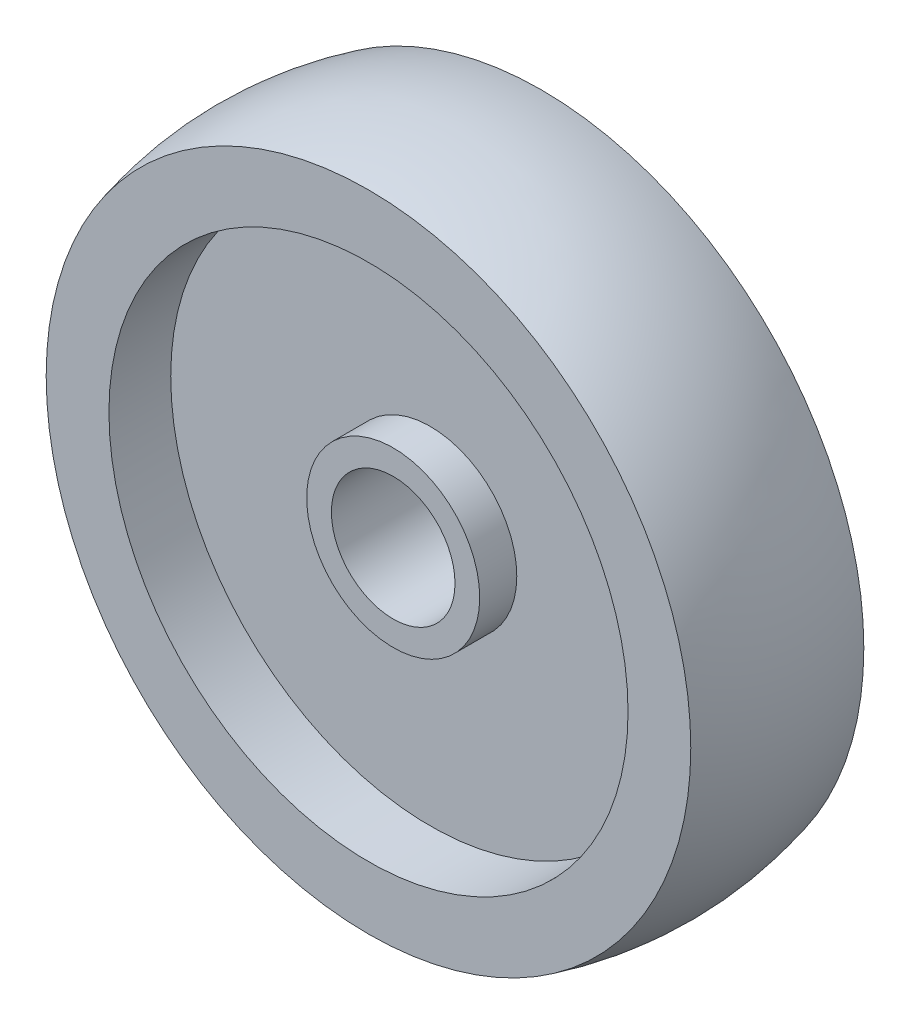
ISO-10303-21;
HEADER;
FILE_DESCRIPTION(('STEP AP214'),'2;1');
FILE_NAME('part.step','',(''),(''),'','','');
FILE_SCHEMA(('AUTOMOTIVE_DESIGN { 1 0 10303 214 1 1 1 1 }'));
ENDSEC;
DATA;
#1=APPLICATION_CONTEXT('core data for automotive mechanical design processes');
#2=APPLICATION_PROTOCOL_DEFINITION('international standard','automotive_design',2000,#1);
#3=PRODUCT_CONTEXT('',#1,'mechanical');
#4=PRODUCT('Part','Part','',(#3));
#5=PRODUCT_RELATED_PRODUCT_CATEGORY('part','',(#4));
#6=PRODUCT_DEFINITION_FORMATION('','',#4);
#7=PRODUCT_DEFINITION_CONTEXT('part definition',#1,'design');
#8=PRODUCT_DEFINITION('design','',#6,#7);
#9=PRODUCT_DEFINITION_SHAPE('','',#8);
#10=(LENGTH_UNIT() NAMED_UNIT(*) SI_UNIT(.MILLI.,.METRE.));
#11=(NAMED_UNIT(*) PLANE_ANGLE_UNIT() SI_UNIT($,.RADIAN.));
#12=(NAMED_UNIT(*) SI_UNIT($,.STERADIAN.) SOLID_ANGLE_UNIT());
#13=UNCERTAINTY_MEASURE_WITH_UNIT(LENGTH_MEASURE(1.E-05),#10,'distance_accuracy_value','');
#14=(GEOMETRIC_REPRESENTATION_CONTEXT(3) GLOBAL_UNCERTAINTY_ASSIGNED_CONTEXT((#13)) GLOBAL_UNIT_ASSIGNED_CONTEXT((#10,
#11,#12)) REPRESENTATION_CONTEXT('',''));
#15=CARTESIAN_POINT('',(0.,0.,0.));
#16=DIRECTION('',(0.,0.,1.));
#17=DIRECTION('',(1.,0.,0.));
#18=AXIS2_PLACEMENT_3D('',#15,#16,#17);
#19=CARTESIAN_POINT('',(0.,0.,-5.));
#20=DIRECTION('',(0.,0.,-1.));
#21=DIRECTION('',(1.,0.,0.));
#22=AXIS2_PLACEMENT_3D('',#19,#20,#21);
#23=PLANE('',#22);
#24=CARTESIAN_POINT('',(0.,0.,-5.));
#25=DIRECTION('',(0.,0.,-1.));
#26=DIRECTION('',(-1.,0.,0.));
#27=AXIS2_PLACEMENT_3D('',#24,#25,#26);
#28=CIRCLE('',#27,5.);
#29=CARTESIAN_POINT('',(-5.,0.,-5.));
#30=VERTEX_POINT('',#29);
#31=EDGE_CURVE('E41',#30,#30,#28,.T.);
#32=ORIENTED_EDGE('',*,*,#31,.F.);
#33=EDGE_LOOP('',(#32));
#34=FACE_BOUND('',#33,.T.);
#35=CARTESIAN_POINT('',(0.,0.,-5.));
#36=DIRECTION('',(0.,0.,1.));
#37=DIRECTION('',(1.,0.,0.));
#38=AXIS2_PLACEMENT_3D('',#35,#36,#37);
#39=CIRCLE('',#38,7.);
#40=CARTESIAN_POINT('',(7.,0.,-5.));
#41=VERTEX_POINT('',#40);
#42=EDGE_CURVE('E86',#41,#41,#39,.T.);
#43=ORIENTED_EDGE('',*,*,#42,.F.);
#44=EDGE_LOOP('',(#43));
#45=FACE_BOUND('',#44,.T.);
#46=ADVANCED_FACE('F37',(#34,#45),#23,.T.);
#47=CARTESIAN_POINT('',(0.,0.,7.));
#48=DIRECTION('',(0.,0.,-1.));
#49=DIRECTION('',(-1.,0.,0.));
#50=AXIS2_PLACEMENT_3D('',#47,#48,#49);
#51=CYLINDRICAL_SURFACE('',#50,5.);
#52=CARTESIAN_POINT('',(0.,0.,5.));
#53=DIRECTION('',(0.,0.,1.));
#54=DIRECTION('',(1.,0.,0.));
#55=AXIS2_PLACEMENT_3D('',#52,#53,#54);
#56=CIRCLE('',#55,5.);
#57=CARTESIAN_POINT('',(5.,0.,5.));
#58=VERTEX_POINT('',#57);
#59=EDGE_CURVE('E52',#58,#58,#56,.T.);
#60=ORIENTED_EDGE('',*,*,#59,.T.);
#61=EDGE_LOOP('',(#60));
#62=FACE_BOUND('',#61,.T.);
#63=ORIENTED_EDGE('',*,*,#31,.T.);
#64=EDGE_LOOP('',(#63));
#65=FACE_BOUND('',#64,.T.);
#66=ADVANCED_FACE('F103',(#62,#65),#51,.F.);
#67=CARTESIAN_POINT('',(0.,0.,5.));
#68=DIRECTION('',(0.,0.,1.));
#69=DIRECTION('',(1.,0.,0.));
#70=AXIS2_PLACEMENT_3D('',#67,#68,#69);
#71=PLANE('',#70);
#72=ORIENTED_EDGE('',*,*,#59,.F.);
#73=EDGE_LOOP('',(#72));
#74=FACE_BOUND('',#73,.T.);
#75=CARTESIAN_POINT('',(0.,0.,5.));
#76=DIRECTION('',(0.,0.,1.));
#77=DIRECTION('',(1.,0.,0.));
#78=AXIS2_PLACEMENT_3D('',#75,#76,#77);
#79=CIRCLE('',#78,7.);
#80=CARTESIAN_POINT('',(7.,0.,5.));
#81=VERTEX_POINT('',#80);
#82=EDGE_CURVE('E70',#81,#81,#79,.T.);
#83=ORIENTED_EDGE('',*,*,#82,.T.);
#84=EDGE_LOOP('',(#83));
#85=FACE_BOUND('',#84,.T.);
#86=ADVANCED_FACE('F109',(#74,#85),#71,.T.);
#87=CARTESIAN_POINT('',(0.,0.,-7.));
#88=DIRECTION('',(0.,0.,1.));
#89=DIRECTION('',(1.,0.,0.));
#90=AXIS2_PLACEMENT_3D('',#87,#88,#89);
#91=PLANE('',#90);
#92=CARTESIAN_POINT('',(0.,0.,-7.));
#93=DIRECTION('',(0.,0.,1.));
#94=DIRECTION('',(1.,0.,0.));
#95=AXIS2_PLACEMENT_3D('',#92,#93,#94);
#96=CIRCLE('',#95,21.);
#97=CARTESIAN_POINT('',(21.,0.,-7.));
#98=VERTEX_POINT('',#97);
#99=EDGE_CURVE('E77',#98,#98,#96,.T.);
#100=ORIENTED_EDGE('',*,*,#99,.T.);
#101=EDGE_LOOP('',(#100));
#102=FACE_BOUND('',#101,.T.);
#103=CARTESIAN_POINT('',(0.,0.,-7.));
#104=DIRECTION('',(0.,0.,-1.));
#105=DIRECTION('',(-1.,0.,0.));
#106=AXIS2_PLACEMENT_3D('',#103,#104,#105);
#107=CIRCLE('',#106,26.0768096208106);
#108=CARTESIAN_POINT('',(0.,26.0768096208106,-7.));
#109=VERTEX_POINT('',#108);
#110=EDGE_CURVE('E46',#109,#109,#107,.T.);
#111=ORIENTED_EDGE('',*,*,#110,.T.);
#112=EDGE_LOOP('',(#111));
#113=FACE_BOUND('',#112,.T.);
#114=ADVANCED_FACE('F39',(#102,#113),#91,.F.);
#115=CARTESIAN_POINT('',(0.,0.,7.));
#116=DIRECTION('',(0.,0.,1.));
#117=DIRECTION('',(1.,0.,0.));
#118=AXIS2_PLACEMENT_3D('',#115,#116,#117);
#119=PLANE('',#118);
#120=CARTESIAN_POINT('',(0.,0.,7.));
#121=DIRECTION('',(0.,0.,1.));
#122=DIRECTION('',(1.,0.,0.));
#123=AXIS2_PLACEMENT_3D('',#120,#121,#122);
#124=CIRCLE('',#123,21.);
#125=CARTESIAN_POINT('',(21.,0.,7.));
#126=VERTEX_POINT('',#125);
#127=EDGE_CURVE('E57',#126,#126,#124,.T.);
#128=ORIENTED_EDGE('',*,*,#127,.F.);
#129=EDGE_LOOP('',(#128));
#130=FACE_BOUND('',#129,.T.);
#131=CARTESIAN_POINT('',(0.,0.,7.));
#132=DIRECTION('',(0.,0.,-1.));
#133=DIRECTION('',(-1.,0.,0.));
#134=AXIS2_PLACEMENT_3D('',#131,#132,#133);
#135=CIRCLE('',#134,26.0768096208106);
#136=CARTESIAN_POINT('',(0.,26.0768096208106,7.));
#137=VERTEX_POINT('',#136);
#138=EDGE_CURVE('E10',#137,#137,#135,.T.);
#139=ORIENTED_EDGE('',*,*,#138,.F.);
#140=EDGE_LOOP('',(#139));
#141=FACE_BOUND('',#140,.T.);
#142=ADVANCED_FACE('F134',(#130,#141),#119,.T.);
#143=CARTESIAN_POINT('',(0.,0.,0.));
#144=DIRECTION('',(0.,0.,-1.));
#145=DIRECTION('',(0.,1.,0.));
#146=AXIS2_PLACEMENT_3D('',#143,#144,#145);
#147=SPHERICAL_SURFACE('',#146,27.);
#148=CARTESIAN_POINT('',(0.,26.0768096208106,7.));
#149=CARTESIAN_POINT('',(0.,26.1150552779347,6.85752548990443));
#150=CARTESIAN_POINT('',(0.,26.1521330666224,6.71473748326667));
#151=CARTESIAN_POINT('',(0.,26.2239434428209,6.42857296261946));
#152=CARTESIAN_POINT('',(0.,26.2586760303317,6.28519644861001));
#153=CARTESIAN_POINT('',(0.,26.3257865398725,5.99789339893214));
#154=CARTESIAN_POINT('',(0.,26.3581644619024,5.85396686326371));
#155=CARTESIAN_POINT('',(0.,26.4205569775978,5.5656024461124));
#156=CARTESIAN_POINT('',(0.,26.4505715712632,5.42116456462951));
#157=CARTESIAN_POINT('',(0.,26.5082293570352,5.13181625771895));
#158=CARTESIAN_POINT('',(0.,26.5358725491418,4.98690583229128));
#159=CARTESIAN_POINT('',(0.,26.5887801078164,4.69665136935476));
#160=CARTESIAN_POINT('',(0.,26.6140444743844,4.55130733184592));
#161=CARTESIAN_POINT('',(0.,26.6621875938432,4.26022469228866));
#162=CARTESIAN_POINT('',(0.,26.685066346734,4.11448609024024));
#163=CARTESIAN_POINT('',(0.,26.7284320924816,3.82265347536639));
#164=CARTESIAN_POINT('',(0.,26.7489190853385,3.67655946254096));
#165=CARTESIAN_POINT('',(0.,26.7874958069922,3.38405527530077));
#166=CARTESIAN_POINT('',(0.,26.8055855357891,3.23764510088601));
#167=CARTESIAN_POINT('',(0.,26.8393628694011,2.94454792460959));
#168=CARTESIAN_POINT('',(0.,26.8550504742162,2.79786092274794));
#169=CARTESIAN_POINT('',(0.,26.8840193452741,2.50424950008764));
#170=CARTESIAN_POINT('',(0.,26.897300611517,2.35732507928899));
#171=CARTESIAN_POINT('',(0.,26.9214532373241,2.06327829105004));
#172=CARTESIAN_POINT('',(0.,26.9323245968885,1.91615592360973));
#173=CARTESIAN_POINT('',(0.,26.9516544886702,1.62175276756224));
#174=CARTESIAN_POINT('',(0.,26.9601130208875,1.47447197895507));
#175=CARTESIAN_POINT('',(0.,26.97461498553,1.17979154860971));
#176=CARTESIAN_POINT('',(0.,26.9806584179552,1.03239190687153));
#177=CARTESIAN_POINT('',(0.,26.9903285594022,0.737513370230746));
#178=CARTESIAN_POINT('',(0.,26.993955268424,0.590034475328142));
#179=CARTESIAN_POINT('',(0.,26.9987909887229,0.295037053617025));
#180=CARTESIAN_POINT('',(0.,27.,0.147518526808513));
#181=CARTESIAN_POINT('',(0.,27.,-0.147518526808513));
#182=CARTESIAN_POINT('',(0.,26.9987909887229,-0.295037053617026));
#183=CARTESIAN_POINT('',(0.,26.993955268424,-0.590034475328142));
#184=CARTESIAN_POINT('',(0.,26.9903285594022,-0.737513370230746));
#185=CARTESIAN_POINT('',(0.,26.9806584179552,-1.03239190687153));
#186=CARTESIAN_POINT('',(0.,26.97461498553,-1.17979154860971));
#187=CARTESIAN_POINT('',(0.,26.9601130208875,-1.47447197895507));
#188=CARTESIAN_POINT('',(0.,26.9516544886702,-1.62175276756224));
#189=CARTESIAN_POINT('',(0.,26.9323245968885,-1.91615592360973));
#190=CARTESIAN_POINT('',(0.,26.9214532373241,-2.06327829105004));
#191=CARTESIAN_POINT('',(0.,26.897300611517,-2.35732507928899));
#192=CARTESIAN_POINT('',(0.,26.8840193452741,-2.50424950008764));
#193=CARTESIAN_POINT('',(0.,26.8550504742162,-2.79786092274794));
#194=CARTESIAN_POINT('',(0.,26.8393628694011,-2.94454792460959));
#195=CARTESIAN_POINT('',(0.,26.8055855357891,-3.23764510088601));
#196=CARTESIAN_POINT('',(0.,26.7874958069922,-3.38405527530077));
#197=CARTESIAN_POINT('',(0.,26.7489190853385,-3.67655946254096));
#198=CARTESIAN_POINT('',(0.,26.7284320924816,-3.82265347536639));
#199=CARTESIAN_POINT('',(0.,26.685066346734,-4.11448609024024));
#200=CARTESIAN_POINT('',(0.,26.6621875938432,-4.26022469228866));
#201=CARTESIAN_POINT('',(0.,26.6140444743844,-4.55130733184592));
#202=CARTESIAN_POINT('',(0.,26.5887801078164,-4.69665136935476));
#203=CARTESIAN_POINT('',(0.,26.5358725491418,-4.98690583229128));
#204=CARTESIAN_POINT('',(0.,26.5082293570352,-5.13181625771895));
#205=CARTESIAN_POINT('',(0.,26.4505715712632,-5.42116456462951));
#206=CARTESIAN_POINT('',(0.,26.4205569775978,-5.5656024461124));
#207=CARTESIAN_POINT('',(0.,26.3581644619024,-5.85396686326371));
#208=CARTESIAN_POINT('',(0.,26.3257865398725,-5.99789339893214));
#209=CARTESIAN_POINT('',(0.,26.2586760303317,-6.28519644861001));
#210=CARTESIAN_POINT('',(0.,26.2239434428209,-6.42857296261946));
#211=CARTESIAN_POINT('',(0.,26.1521330666224,-6.71473748326667));
#212=CARTESIAN_POINT('',(0.,26.1150552779347,-6.85752548990443));
#213=CARTESIAN_POINT('',(0.,26.0768096208106,-7.));
#214=B_SPLINE_CURVE_WITH_KNOTS('',3,(#148,#149,#150,#151,#152,#153,#154,#155,#156,#157,#158,
#159,#160,#161,#162,#163,#164,#165,#166,#167,#168,#169,#170,#171,#172,#173,#174,#175,#176,#177,
#178,#179,#180,#181,#182,#183,#184,#185,#186,#187,#188,#189,#190,#191,#192,#193,#194,#195,#196,
#197,#198,#199,#200,#201,#202,#203,#204,#205,#206,#207,#208,#209,#210,#211,#212,#213),
.UNSPECIFIED.,.F.,.F.,(4,2,2,2,2,2,2,2,2,2,2,2,2,2,2,2,2,2,2,2,2,2,2,2,2,2,2,2,2,2,2,2,4),(0.,
0.442550626520491,0.885101253040982,1.32765187956147,1.77020250608196,2.21275313260245,
2.65530375912294,3.09785438564344,3.54040501216393,3.98295563868442,4.42550626520491,
4.8680568917254,5.31060751824589,5.75315814476638,6.19570877128687,6.63825939780736,
7.08081002432785,7.52336065084834,7.96591127736883,8.40846190388932,8.85101253040981,
9.2935631569303,9.7361137834508,10.1786644099713,10.6212150364918,11.0637656630123,
11.5063162895328,11.9488669160532,12.3914175425737,12.8339681690942,13.2765187956147,
13.7190694221352,14.1616200486557),.UNSPECIFIED.);
#215=EDGE_CURVE('BSEAM132',#137,#109,#214,.T.);
#216=ORIENTED_EDGE('',*,*,#138,.T.);
#217=ORIENTED_EDGE('',*,*,#110,.F.);
#218=ORIENTED_EDGE('',*,*,#215,.T.);
#219=ORIENTED_EDGE('',*,*,#215,.F.);
#220=EDGE_LOOP('',(#216,#218,#217,#219));
#221=FACE_BOUND('',#220,.T.);
#222=ADVANCED_FACE('F132',(#221),#147,.T.);
#223=CARTESIAN_POINT('',(0.,0.,5.));
#224=DIRECTION('',(0.,0.,1.));
#225=DIRECTION('',(1.,0.,0.));
#226=AXIS2_PLACEMENT_3D('',#223,#224,#225);
#227=CYLINDRICAL_SURFACE('',#226,21.);
#228=ORIENTED_EDGE('',*,*,#127,.T.);
#229=EDGE_LOOP('',(#228));
#230=FACE_BOUND('',#229,.T.);
#231=CARTESIAN_POINT('',(0.,0.,2.));
#232=DIRECTION('',(0.,0.,1.));
#233=DIRECTION('',(1.,0.,0.));
#234=AXIS2_PLACEMENT_3D('',#231,#232,#233);
#235=CIRCLE('',#234,21.);
#236=CARTESIAN_POINT('',(21.,0.,2.));
#237=VERTEX_POINT('',#236);
#238=EDGE_CURVE('E62',#237,#237,#235,.T.);
#239=ORIENTED_EDGE('',*,*,#238,.F.);
#240=EDGE_LOOP('',(#239));
#241=FACE_BOUND('',#240,.T.);
#242=ADVANCED_FACE('F125',(#230,#241),#227,.F.);
#243=CARTESIAN_POINT('',(0.,0.,2.));
#244=DIRECTION('',(0.,0.,1.));
#245=DIRECTION('',(1.,0.,0.));
#246=AXIS2_PLACEMENT_3D('',#243,#244,#245);
#247=PLANE('',#246);
#248=CARTESIAN_POINT('',(0.,0.,2.));
#249=DIRECTION('',(0.,0.,1.));
#250=DIRECTION('',(1.,0.,0.));
#251=AXIS2_PLACEMENT_3D('',#248,#249,#250);
#252=CIRCLE('',#251,7.);
#253=CARTESIAN_POINT('',(7.,0.,2.));
#254=VERTEX_POINT('',#253);
#255=EDGE_CURVE('E67',#254,#254,#252,.T.);
#256=ORIENTED_EDGE('',*,*,#255,.F.);
#257=EDGE_LOOP('',(#256));
#258=FACE_BOUND('',#257,.T.);
#259=ORIENTED_EDGE('',*,*,#238,.T.);
#260=EDGE_LOOP('',(#259));
#261=FACE_BOUND('',#260,.T.);
#262=ADVANCED_FACE('F121',(#258,#261),#247,.T.);
#263=CARTESIAN_POINT('',(0.,0.,2.));
#264=DIRECTION('',(0.,0.,1.));
#265=DIRECTION('',(1.,0.,0.));
#266=AXIS2_PLACEMENT_3D('',#263,#264,#265);
#267=CYLINDRICAL_SURFACE('',#266,7.);
#268=ORIENTED_EDGE('',*,*,#255,.T.);
#269=EDGE_LOOP('',(#268));
#270=FACE_BOUND('',#269,.T.);
#271=ORIENTED_EDGE('',*,*,#82,.F.);
#272=EDGE_LOOP('',(#271));
#273=FACE_BOUND('',#272,.T.);
#274=ADVANCED_FACE('F117',(#270,#273),#267,.T.);
#275=CARTESIAN_POINT('',(0.,0.,-5.));
#276=DIRECTION('',(0.,0.,-1.));
#277=DIRECTION('',(-1.,0.,0.));
#278=AXIS2_PLACEMENT_3D('',#275,#276,#277);
#279=CYLINDRICAL_SURFACE('',#278,21.);
#280=ORIENTED_EDGE('',*,*,#99,.F.);
#281=EDGE_LOOP('',(#280));
#282=FACE_BOUND('',#281,.T.);
#283=CARTESIAN_POINT('',(0.,0.,-2.));
#284=DIRECTION('',(0.,0.,1.));
#285=DIRECTION('',(1.,0.,0.));
#286=AXIS2_PLACEMENT_3D('',#283,#284,#285);
#287=CIRCLE('',#286,21.);
#288=CARTESIAN_POINT('',(21.,0.,-2.));
#289=VERTEX_POINT('',#288);
#290=EDGE_CURVE('E81',#289,#289,#287,.T.);
#291=ORIENTED_EDGE('',*,*,#290,.T.);
#292=EDGE_LOOP('',(#291));
#293=FACE_BOUND('',#292,.T.);
#294=ADVANCED_FACE('F114',(#282,#293),#279,.F.);
#295=CARTESIAN_POINT('',(0.,0.,-2.));
#296=DIRECTION('',(0.,0.,-1.));
#297=DIRECTION('',(1.,0.,0.));
#298=AXIS2_PLACEMENT_3D('',#295,#296,#297);
#299=PLANE('',#298);
#300=ORIENTED_EDGE('',*,*,#290,.F.);
#301=EDGE_LOOP('',(#300));
#302=FACE_BOUND('',#301,.T.);
#303=CARTESIAN_POINT('',(0.,0.,-2.));
#304=DIRECTION('',(0.,0.,1.));
#305=DIRECTION('',(1.,0.,0.));
#306=AXIS2_PLACEMENT_3D('',#303,#304,#305);
#307=CIRCLE('',#306,7.);
#308=CARTESIAN_POINT('',(7.,0.,-2.));
#309=VERTEX_POINT('',#308);
#310=EDGE_CURVE('E85',#309,#309,#307,.T.);
#311=ORIENTED_EDGE('',*,*,#310,.T.);
#312=EDGE_LOOP('',(#311));
#313=FACE_BOUND('',#312,.T.);
#314=ADVANCED_FACE('F94',(#302,#313),#299,.T.);
#315=CARTESIAN_POINT('',(0.,0.,-2.));
#316=DIRECTION('',(0.,0.,-1.));
#317=DIRECTION('',(-1.,0.,0.));
#318=AXIS2_PLACEMENT_3D('',#315,#316,#317);
#319=CYLINDRICAL_SURFACE('',#318,7.);
#320=ORIENTED_EDGE('',*,*,#310,.F.);
#321=EDGE_LOOP('',(#320));
#322=FACE_BOUND('',#321,.T.);
#323=ORIENTED_EDGE('',*,*,#42,.T.);
#324=EDGE_LOOP('',(#323));
#325=FACE_BOUND('',#324,.T.);
#326=ADVANCED_FACE('F96',(#322,#325),#319,.T.);
#327=CLOSED_SHELL('',(#46,#66,#86,#114,#142,#222,#242,#262,#274,#294,#314,#326));
#328=MANIFOLD_SOLID_BREP('B2',#327);
#329=ADVANCED_BREP_SHAPE_REPRESENTATION('',(#18,#328),#14);
#330=SHAPE_DEFINITION_REPRESENTATION(#9,#329);
ENDSEC;
END-ISO-10303-21;
